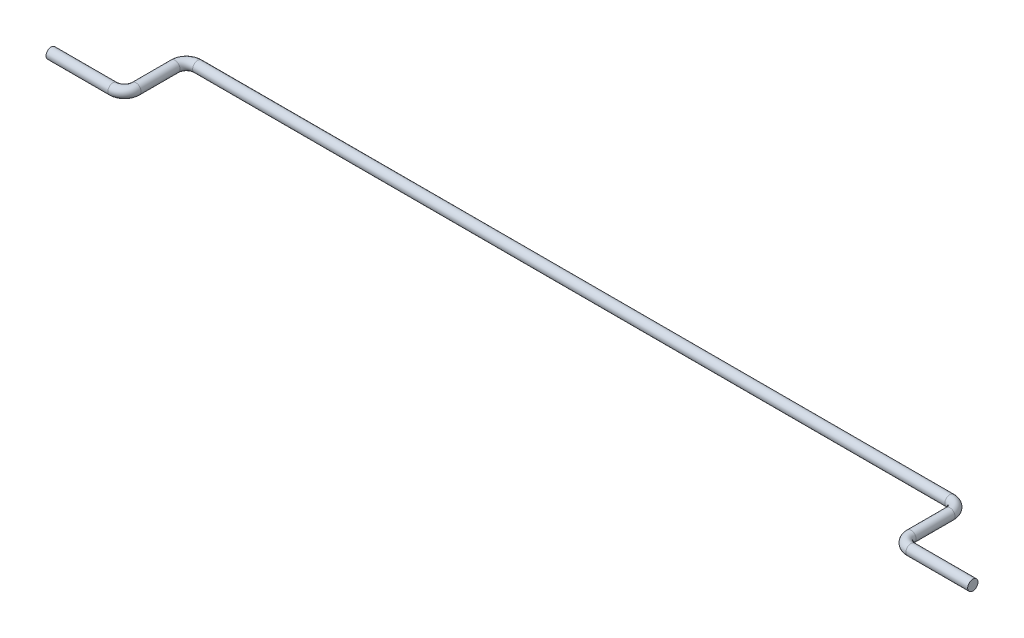
ISO-10303-21;
HEADER;
FILE_DESCRIPTION(('STEP AP214'),'2;1');
FILE_NAME('part.step','',(''),(''),'','','');
FILE_SCHEMA(('AUTOMOTIVE_DESIGN { 1 0 10303 214 1 1 1 1 }'));
ENDSEC;
DATA;
#1=APPLICATION_CONTEXT('core data for automotive mechanical design processes');
#2=APPLICATION_PROTOCOL_DEFINITION('international standard','automotive_design',2000,#1);
#3=PRODUCT_CONTEXT('',#1,'mechanical');
#4=PRODUCT('Part','Part','',(#3));
#5=PRODUCT_RELATED_PRODUCT_CATEGORY('part','',(#4));
#6=PRODUCT_DEFINITION_FORMATION('','',#4);
#7=PRODUCT_DEFINITION_CONTEXT('part definition',#1,'design');
#8=PRODUCT_DEFINITION('design','',#6,#7);
#9=PRODUCT_DEFINITION_SHAPE('','',#8);
#10=(LENGTH_UNIT() NAMED_UNIT(*) SI_UNIT(.MILLI.,.METRE.));
#11=(NAMED_UNIT(*) PLANE_ANGLE_UNIT() SI_UNIT($,.RADIAN.));
#12=(NAMED_UNIT(*) SI_UNIT($,.STERADIAN.) SOLID_ANGLE_UNIT());
#13=UNCERTAINTY_MEASURE_WITH_UNIT(LENGTH_MEASURE(1.E-05),#10,'distance_accuracy_value','');
#14=(GEOMETRIC_REPRESENTATION_CONTEXT(3) GLOBAL_UNCERTAINTY_ASSIGNED_CONTEXT((#13)) GLOBAL_UNIT_ASSIGNED_CONTEXT((#10,
#11,#12)) REPRESENTATION_CONTEXT('',''));
#15=CARTESIAN_POINT('',(0.,0.,0.));
#16=DIRECTION('',(0.,0.,1.));
#17=DIRECTION('',(1.,0.,0.));
#18=AXIS2_PLACEMENT_3D('',#15,#16,#17);
#19=CARTESIAN_POINT('',(95.3262,0.,0.));
#20=DIRECTION('',(1.,0.,0.));
#21=DIRECTION('',(0.,0.,-1.));
#22=AXIS2_PLACEMENT_3D('',#19,#20,#21);
#23=CYLINDRICAL_SURFACE('',#22,0.5715);
#24=CARTESIAN_POINT('',(95.3262,0.,0.));
#25=DIRECTION('',(1.,0.,0.));
#26=DIRECTION('',(0.,0.,-1.));
#27=AXIS2_PLACEMENT_3D('',#24,#25,#26);
#28=CIRCLE('',#27,0.5715);
#29=CARTESIAN_POINT('',(95.3262,0.,0.571499999999993));
#30=VERTEX_POINT('',#29);
#31=EDGE_CURVE('E41',#30,#30,#28,.T.);
#32=ORIENTED_EDGE('',*,*,#31,.T.);
#33=EDGE_LOOP('',(#32));
#34=FACE_BOUND('',#33,.T.);
#35=CARTESIAN_POINT('',(102.1842,0.,0.));
#36=DIRECTION('',(1.,0.,0.));
#37=DIRECTION('',(0.,0.,-1.));
#38=AXIS2_PLACEMENT_3D('',#35,#36,#37);
#39=CIRCLE('',#38,0.5715);
#40=CARTESIAN_POINT('',(102.1842,0.,-0.571499999999997));
#41=VERTEX_POINT('',#40);
#42=EDGE_CURVE('E10',#41,#41,#39,.T.);
#43=ORIENTED_EDGE('',*,*,#42,.F.);
#44=EDGE_LOOP('',(#43));
#45=FACE_BOUND('',#44,.T.);
#46=ADVANCED_FACE('F35',(#34,#45),#23,.T.);
#47=CARTESIAN_POINT('',(95.3262,0.,-1.27));
#48=DIRECTION('',(0.,1.,0.));
#49=DIRECTION('',(0.,0.,1.));
#50=AXIS2_PLACEMENT_3D('',#47,#48,#49);
#51=TOROIDAL_SURFACE('',#50,1.26999999999999,0.5715);
#52=CARTESIAN_POINT('',(94.0562,0.,-1.27000000000001));
#53=DIRECTION('',(0.,0.,1.));
#54=DIRECTION('',(1.,0.,0.));
#55=AXIS2_PLACEMENT_3D('',#52,#53,#54);
#56=CIRCLE('',#55,0.5715);
#57=CARTESIAN_POINT('',(93.4847,0.,-1.27000000000002));
#58=VERTEX_POINT('',#57);
#59=EDGE_CURVE('E45',#58,#58,#56,.T.);
#60=CARTESIAN_POINT('',(95.3262,0.,-1.27));
#61=DIRECTION('',(0.,1.,0.));
#62=DIRECTION('',(0.,0.,1.));
#63=AXIS2_PLACEMENT_3D('',#60,#61,#62);
#64=CIRCLE('',#63,1.84149999999999);
#65=EDGE_CURVE('',#58,#30,#64,.T.);
#66=ORIENTED_EDGE('',*,*,#59,.T.);
#67=ORIENTED_EDGE('',*,*,#31,.F.);
#68=ORIENTED_EDGE('',*,*,#65,.T.);
#69=ORIENTED_EDGE('',*,*,#65,.F.);
#70=EDGE_LOOP('',(#66,#68,#67,#69));
#71=FACE_BOUND('',#70,.T.);
#72=ADVANCED_FACE('F91',(#71),#51,.T.);
#73=CARTESIAN_POINT('',(94.0562,0.,-5.588));
#74=DIRECTION('',(0.,0.,1.));
#75=DIRECTION('',(1.,0.,0.));
#76=AXIS2_PLACEMENT_3D('',#73,#74,#75);
#77=CYLINDRICAL_SURFACE('',#76,0.5715);
#78=CARTESIAN_POINT('',(94.0562,0.,-5.588));
#79=DIRECTION('',(0.,0.,1.));
#80=DIRECTION('',(1.,0.,0.));
#81=AXIS2_PLACEMENT_3D('',#78,#79,#80);
#82=CIRCLE('',#81,0.5715);
#83=CARTESIAN_POINT('',(94.6277,0.,-5.58799999999999));
#84=VERTEX_POINT('',#83);
#85=EDGE_CURVE('E49',#84,#84,#82,.T.);
#86=ORIENTED_EDGE('',*,*,#85,.T.);
#87=EDGE_LOOP('',(#86));
#88=FACE_BOUND('',#87,.T.);
#89=ORIENTED_EDGE('',*,*,#59,.F.);
#90=EDGE_LOOP('',(#89));
#91=FACE_BOUND('',#90,.T.);
#92=ADVANCED_FACE('F95',(#88,#91),#77,.T.);
#93=CARTESIAN_POINT('',(92.7862,0.,-5.588));
#94=DIRECTION('',(0.,-1.,0.));
#95=DIRECTION('',(0.,0.,-1.));
#96=AXIS2_PLACEMENT_3D('',#93,#94,#95);
#97=TOROIDAL_SURFACE('',#96,1.27,0.5715);
#98=CARTESIAN_POINT('',(92.7862,0.,-6.858));
#99=DIRECTION('',(1.,0.,0.));
#100=DIRECTION('',(0.,0.,-1.));
#101=AXIS2_PLACEMENT_3D('',#98,#99,#100);
#102=CIRCLE('',#101,0.5715);
#103=CARTESIAN_POINT('',(92.7862,0.,-7.4295));
#104=VERTEX_POINT('',#103);
#105=EDGE_CURVE('E54',#104,#104,#102,.T.);
#106=CARTESIAN_POINT('',(92.7862,0.,-5.588));
#107=DIRECTION('',(0.,-1.,0.));
#108=DIRECTION('',(0.,0.,-1.));
#109=AXIS2_PLACEMENT_3D('',#106,#107,#108);
#110=CIRCLE('',#109,1.8415);
#111=EDGE_CURVE('',#104,#84,#110,.T.);
#112=ORIENTED_EDGE('',*,*,#105,.T.);
#113=ORIENTED_EDGE('',*,*,#85,.F.);
#114=ORIENTED_EDGE('',*,*,#111,.T.);
#115=ORIENTED_EDGE('',*,*,#111,.F.);
#116=EDGE_LOOP('',(#112,#114,#113,#115));
#117=FACE_BOUND('',#116,.T.);
#118=ADVANCED_FACE('F101',(#117),#97,.T.);
#119=CARTESIAN_POINT('',(9.39800000000001,0.,-6.858));
#120=DIRECTION('',(1.,0.,0.));
#121=DIRECTION('',(0.,0.,-1.));
#122=AXIS2_PLACEMENT_3D('',#119,#120,#121);
#123=CYLINDRICAL_SURFACE('',#122,0.5715);
#124=CARTESIAN_POINT('',(9.39800000000001,0.,-6.858));
#125=DIRECTION('',(1.,0.,0.));
#126=DIRECTION('',(0.,0.,-1.));
#127=AXIS2_PLACEMENT_3D('',#124,#125,#126);
#128=CIRCLE('',#127,0.5715);
#129=CARTESIAN_POINT('',(9.39800000000002,0.,-7.4295));
#130=VERTEX_POINT('',#129);
#131=EDGE_CURVE('E57',#130,#130,#128,.T.);
#132=ORIENTED_EDGE('',*,*,#131,.T.);
#133=EDGE_LOOP('',(#132));
#134=FACE_BOUND('',#133,.T.);
#135=ORIENTED_EDGE('',*,*,#105,.F.);
#136=EDGE_LOOP('',(#135));
#137=FACE_BOUND('',#136,.T.);
#138=ADVANCED_FACE('F108',(#134,#137),#123,.T.);
#139=CARTESIAN_POINT('',(9.398,0.,-5.588));
#140=DIRECTION('',(0.,-1.,0.));
#141=DIRECTION('',(0.,0.,-1.));
#142=AXIS2_PLACEMENT_3D('',#139,#140,#141);
#143=TOROIDAL_SURFACE('',#142,1.27,0.5715);
#144=CARTESIAN_POINT('',(8.128,0.,-5.58799999999999));
#145=DIRECTION('',(0.,0.,-1.));
#146=DIRECTION('',(-1.,0.,0.));
#147=AXIS2_PLACEMENT_3D('',#144,#145,#146);
#148=CIRCLE('',#147,0.5715);
#149=CARTESIAN_POINT('',(7.5565,0.,-5.58799999999999));
#150=VERTEX_POINT('',#149);
#151=EDGE_CURVE('E60',#150,#150,#148,.T.);
#152=CARTESIAN_POINT('',(9.398,0.,-5.588));
#153=DIRECTION('',(0.,-1.,0.));
#154=DIRECTION('',(0.,0.,-1.));
#155=AXIS2_PLACEMENT_3D('',#152,#153,#154);
#156=CIRCLE('',#155,1.8415);
#157=EDGE_CURVE('',#150,#130,#156,.T.);
#158=ORIENTED_EDGE('',*,*,#151,.T.);
#159=ORIENTED_EDGE('',*,*,#131,.F.);
#160=ORIENTED_EDGE('',*,*,#157,.T.);
#161=ORIENTED_EDGE('',*,*,#157,.F.);
#162=EDGE_LOOP('',(#158,#160,#159,#161));
#163=FACE_BOUND('',#162,.T.);
#164=ADVANCED_FACE('F112',(#163),#143,.T.);
#165=CARTESIAN_POINT('',(8.128,0.,-1.27000000000001));
#166=DIRECTION('',(0.,0.,-1.));
#167=DIRECTION('',(-1.,0.,0.));
#168=AXIS2_PLACEMENT_3D('',#165,#166,#167);
#169=CYLINDRICAL_SURFACE('',#168,0.5715);
#170=CARTESIAN_POINT('',(8.128,0.,-1.27000000000001));
#171=DIRECTION('',(0.,0.,-1.));
#172=DIRECTION('',(-1.,0.,0.));
#173=AXIS2_PLACEMENT_3D('',#170,#171,#172);
#174=CIRCLE('',#173,0.5715);
#175=CARTESIAN_POINT('',(8.6995,0.,-1.27000000000001));
#176=VERTEX_POINT('',#175);
#177=EDGE_CURVE('E63',#176,#176,#174,.T.);
#178=ORIENTED_EDGE('',*,*,#177,.T.);
#179=EDGE_LOOP('',(#178));
#180=FACE_BOUND('',#179,.T.);
#181=ORIENTED_EDGE('',*,*,#151,.F.);
#182=EDGE_LOOP('',(#181));
#183=FACE_BOUND('',#182,.T.);
#184=ADVANCED_FACE('F116',(#180,#183),#169,.T.);
#185=CARTESIAN_POINT('',(6.858,0.,-1.27));
#186=DIRECTION('',(0.,1.,0.));
#187=DIRECTION('',(0.,0.,1.));
#188=AXIS2_PLACEMENT_3D('',#185,#186,#187);
#189=TOROIDAL_SURFACE('',#188,1.27,0.5715);
#190=CARTESIAN_POINT('',(6.85799999999999,0.,0.));
#191=DIRECTION('',(1.,0.,0.));
#192=DIRECTION('',(0.,0.,-1.));
#193=AXIS2_PLACEMENT_3D('',#190,#191,#192);
#194=CIRCLE('',#193,0.5715);
#195=CARTESIAN_POINT('',(6.85799999999999,0.,0.5715));
#196=VERTEX_POINT('',#195);
#197=EDGE_CURVE('E66',#196,#196,#194,.T.);
#198=CARTESIAN_POINT('',(6.858,0.,-1.27));
#199=DIRECTION('',(0.,1.,0.));
#200=DIRECTION('',(0.,0.,1.));
#201=AXIS2_PLACEMENT_3D('',#198,#199,#200);
#202=CIRCLE('',#201,1.8415);
#203=EDGE_CURVE('',#196,#176,#202,.T.);
#204=ORIENTED_EDGE('',*,*,#197,.T.);
#205=ORIENTED_EDGE('',*,*,#177,.F.);
#206=ORIENTED_EDGE('',*,*,#203,.T.);
#207=ORIENTED_EDGE('',*,*,#203,.F.);
#208=EDGE_LOOP('',(#204,#206,#205,#207));
#209=FACE_BOUND('',#208,.T.);
#210=ADVANCED_FACE('F73',(#209),#189,.T.);
#211=CARTESIAN_POINT('',(6.85799999999999,0.,0.));
#212=DIRECTION('',(-1.,0.,0.));
#213=DIRECTION('',(0.,0.,1.));
#214=AXIS2_PLACEMENT_3D('',#211,#212,#213);
#215=CYLINDRICAL_SURFACE('',#214,0.5715);
#216=ORIENTED_EDGE('',*,*,#197,.F.);
#217=EDGE_LOOP('',(#216));
#218=FACE_BOUND('',#217,.T.);
#219=CARTESIAN_POINT('',(0.,0.,0.));
#220=DIRECTION('',(1.,0.,0.));
#221=DIRECTION('',(0.,0.,-1.));
#222=AXIS2_PLACEMENT_3D('',#219,#220,#221);
#223=CIRCLE('',#222,0.5715);
#224=CARTESIAN_POINT('',(0.,0.,-0.5715));
#225=VERTEX_POINT('',#224);
#226=EDGE_CURVE('E67',#225,#225,#223,.T.);
#227=ORIENTED_EDGE('',*,*,#226,.T.);
#228=EDGE_LOOP('',(#227));
#229=FACE_BOUND('',#228,.T.);
#230=ADVANCED_FACE('F76',(#218,#229),#215,.T.);
#231=CARTESIAN_POINT('',(102.1842,0.,0.));
#232=DIRECTION('',(1.,0.,0.));
#233=DIRECTION('',(0.,0.,-1.));
#234=AXIS2_PLACEMENT_3D('',#231,#232,#233);
#235=PLANE('',#234);
#236=ORIENTED_EDGE('',*,*,#42,.T.);
#237=EDGE_LOOP('',(#236));
#238=FACE_BOUND('',#237,.T.);
#239=ADVANCED_FACE('F79',(#238),#235,.T.);
#240=CARTESIAN_POINT('',(0.,0.,0.));
#241=DIRECTION('',(1.,0.,0.));
#242=DIRECTION('',(0.,0.,-1.));
#243=AXIS2_PLACEMENT_3D('',#240,#241,#242);
#244=PLANE('',#243);
#245=ORIENTED_EDGE('',*,*,#226,.F.);
#246=EDGE_LOOP('',(#245));
#247=FACE_BOUND('',#246,.T.);
#248=ADVANCED_FACE('F83',(#247),#244,.F.);
#249=CLOSED_SHELL('',(#46,#72,#92,#118,#138,#164,#184,#210,#230,#239,#248));
#250=MANIFOLD_SOLID_BREP('B2',#249);
#251=ADVANCED_BREP_SHAPE_REPRESENTATION('',(#18,#250),#14);
#252=SHAPE_DEFINITION_REPRESENTATION(#9,#251);
ENDSEC;
END-ISO-10303-21;
